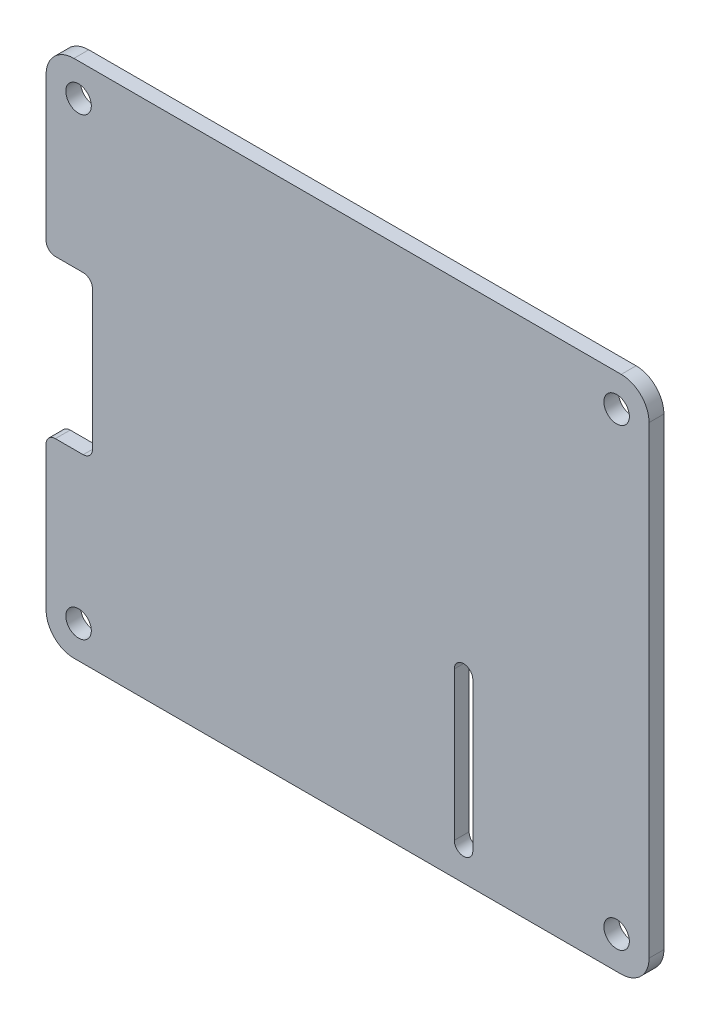
ISO-10303-21;
HEADER;
FILE_DESCRIPTION(('STEP AP214'),'2;1');
FILE_NAME('part.step','',(''),(''),'','','');
FILE_SCHEMA(('AUTOMOTIVE_DESIGN { 1 0 10303 214 1 1 1 1 }'));
ENDSEC;
DATA;
#1=APPLICATION_CONTEXT('core data for automotive mechanical design processes');
#2=APPLICATION_PROTOCOL_DEFINITION('international standard','automotive_design',2000,#1);
#3=PRODUCT_CONTEXT('',#1,'mechanical');
#4=PRODUCT('Part','Part','',(#3));
#5=PRODUCT_RELATED_PRODUCT_CATEGORY('part','',(#4));
#6=PRODUCT_DEFINITION_FORMATION('','',#4);
#7=PRODUCT_DEFINITION_CONTEXT('part definition',#1,'design');
#8=PRODUCT_DEFINITION('design','',#6,#7);
#9=PRODUCT_DEFINITION_SHAPE('','',#8);
#10=(LENGTH_UNIT() NAMED_UNIT(*) SI_UNIT(.MILLI.,.METRE.));
#11=(NAMED_UNIT(*) PLANE_ANGLE_UNIT() SI_UNIT($,.RADIAN.));
#12=(NAMED_UNIT(*) SI_UNIT($,.STERADIAN.) SOLID_ANGLE_UNIT());
#13=UNCERTAINTY_MEASURE_WITH_UNIT(LENGTH_MEASURE(1.E-05),#10,'distance_accuracy_value','');
#14=(GEOMETRIC_REPRESENTATION_CONTEXT(3) GLOBAL_UNCERTAINTY_ASSIGNED_CONTEXT((#13)) GLOBAL_UNIT_ASSIGNED_CONTEXT((#10,
#11,#12)) REPRESENTATION_CONTEXT('',''));
#15=CARTESIAN_POINT('',(0.,0.,0.));
#16=DIRECTION('',(0.,0.,1.));
#17=DIRECTION('',(1.,0.,0.));
#18=AXIS2_PLACEMENT_3D('',#15,#16,#17);
#19=CARTESIAN_POINT('',(-29.5,25.,1.6));
#20=DIRECTION('',(0.,0.,-1.));
#21=DIRECTION('',(-1.,0.,0.));
#22=AXIS2_PLACEMENT_3D('',#19,#20,#21);
#23=CYLINDRICAL_SURFACE('',#22,3.);
#24=CARTESIAN_POINT('',(-29.5,25.,0.));
#25=DIRECTION('',(0.,0.,1.));
#26=DIRECTION('',(1.,0.,0.));
#27=AXIS2_PLACEMENT_3D('',#24,#25,#26);
#28=CIRCLE('',#27,3.);
#29=CARTESIAN_POINT('',(-29.5,28.,0.));
#30=VERTEX_POINT('',#29);
#31=CARTESIAN_POINT('',(-32.5,25.,0.));
#32=VERTEX_POINT('',#31);
#33=EDGE_CURVE('E204',#30,#32,#28,.T.);
#34=ORIENTED_EDGE('',*,*,#33,.T.);
#35=DIRECTION('',(0.,0.,-1.));
#36=VECTOR('',#35,1.);
#37=CARTESIAN_POINT('',(-32.5,25.,1.6));
#38=LINE('',#37,#36);
#39=CARTESIAN_POINT('',(-32.5,25.,1.6));
#40=VERTEX_POINT('',#39);
#41=EDGE_CURVE('E11',#40,#32,#38,.T.);
#42=ORIENTED_EDGE('',*,*,#41,.F.);
#43=CARTESIAN_POINT('',(-29.5,25.,1.6));
#44=DIRECTION('',(0.,0.,1.));
#45=DIRECTION('',(1.,0.,0.));
#46=AXIS2_PLACEMENT_3D('',#43,#44,#45);
#47=CIRCLE('',#46,3.);
#48=CARTESIAN_POINT('',(-29.5,28.,1.6));
#49=VERTEX_POINT('',#48);
#50=EDGE_CURVE('E208',#49,#40,#47,.T.);
#51=ORIENTED_EDGE('',*,*,#50,.F.);
#52=DIRECTION('',(0.,0.,-1.));
#53=VECTOR('',#52,1.);
#54=CARTESIAN_POINT('',(-29.5,28.,1.6));
#55=LINE('',#54,#53);
#56=EDGE_CURVE('E248',#49,#30,#55,.T.);
#57=ORIENTED_EDGE('',*,*,#56,.T.);
#58=EDGE_LOOP('',(#34,#42,#51,#57));
#59=FACE_BOUND('',#58,.T.);
#60=ADVANCED_FACE('F32',(#59),#23,.T.);
#61=CARTESIAN_POINT('',(-32.5,9.50000000000001,1.6));
#62=DIRECTION('',(-1.,0.,0.));
#63=DIRECTION('',(0.,0.,1.));
#64=AXIS2_PLACEMENT_3D('',#61,#62,#63);
#65=PLANE('',#64);
#66=DIRECTION('',(0.,1.,0.));
#67=VECTOR('',#66,1.);
#68=CARTESIAN_POINT('',(-32.5,9.50000000000001,0.));
#69=LINE('',#68,#67);
#70=CARTESIAN_POINT('',(-32.5,9.50000000000001,0.));
#71=VERTEX_POINT('',#70);
#72=EDGE_CURVE('E251',#71,#32,#69,.T.);
#73=ORIENTED_EDGE('',*,*,#72,.F.);
#74=DIRECTION('',(0.,0.,-1.));
#75=VECTOR('',#74,1.);
#76=CARTESIAN_POINT('',(-32.5,9.50000000000001,1.6));
#77=LINE('',#76,#75);
#78=CARTESIAN_POINT('',(-32.5,9.50000000000001,1.6));
#79=VERTEX_POINT('',#78);
#80=EDGE_CURVE('E39',#79,#71,#77,.T.);
#81=ORIENTED_EDGE('',*,*,#80,.F.);
#82=DIRECTION('',(0.,1.,0.));
#83=VECTOR('',#82,1.);
#84=CARTESIAN_POINT('',(-32.5,9.50000000000001,1.6));
#85=LINE('',#84,#83);
#86=EDGE_CURVE('E210',#79,#40,#85,.T.);
#87=ORIENTED_EDGE('',*,*,#86,.T.);
#88=ORIENTED_EDGE('',*,*,#41,.T.);
#89=EDGE_LOOP('',(#73,#81,#87,#88));
#90=FACE_BOUND('',#89,.T.);
#91=ADVANCED_FACE('F331',(#90),#65,.T.);
#92=CARTESIAN_POINT('',(-31.5,9.5,1.6));
#93=DIRECTION('',(0.,0.,-1.));
#94=DIRECTION('',(-1.,0.,0.));
#95=AXIS2_PLACEMENT_3D('',#92,#93,#94);
#96=CYLINDRICAL_SURFACE('',#95,1.);
#97=CARTESIAN_POINT('',(-31.5,9.5,0.));
#98=DIRECTION('',(0.,0.,1.));
#99=DIRECTION('',(1.,0.,0.));
#100=AXIS2_PLACEMENT_3D('',#97,#98,#99);
#101=CIRCLE('',#100,1.);
#102=CARTESIAN_POINT('',(-31.5,8.5,0.));
#103=VERTEX_POINT('',#102);
#104=EDGE_CURVE('E254',#71,#103,#101,.T.);
#105=ORIENTED_EDGE('',*,*,#104,.T.);
#106=DIRECTION('',(0.,0.,-1.));
#107=VECTOR('',#106,1.);
#108=CARTESIAN_POINT('',(-31.5,8.5,1.6));
#109=LINE('',#108,#107);
#110=CARTESIAN_POINT('',(-31.5,8.5,1.6));
#111=VERTEX_POINT('',#110);
#112=EDGE_CURVE('E319',#111,#103,#109,.T.);
#113=ORIENTED_EDGE('',*,*,#112,.F.);
#114=CARTESIAN_POINT('',(-31.5,9.5,1.6));
#115=DIRECTION('',(0.,0.,1.));
#116=DIRECTION('',(1.,0.,0.));
#117=AXIS2_PLACEMENT_3D('',#114,#115,#116);
#118=CIRCLE('',#117,1.);
#119=EDGE_CURVE('E214',#79,#111,#118,.T.);
#120=ORIENTED_EDGE('',*,*,#119,.F.);
#121=ORIENTED_EDGE('',*,*,#80,.T.);
#122=EDGE_LOOP('',(#105,#113,#120,#121));
#123=FACE_BOUND('',#122,.T.);
#124=ADVANCED_FACE('F324',(#123),#96,.T.);
#125=CARTESIAN_POINT('',(-31.5,8.5,1.6));
#126=DIRECTION('',(0.,1.,0.));
#127=DIRECTION('',(-1.,0.,0.));
#128=AXIS2_PLACEMENT_3D('',#125,#126,#127);
#129=PLANE('',#128);
#130=DIRECTION('',(1.,0.,0.));
#131=VECTOR('',#130,1.);
#132=CARTESIAN_POINT('',(-31.5,8.5,0.));
#133=LINE('',#132,#131);
#134=CARTESIAN_POINT('',(-28.5,8.49999999999999,0.));
#135=VERTEX_POINT('',#134);
#136=EDGE_CURVE('E256',#103,#135,#133,.T.);
#137=ORIENTED_EDGE('',*,*,#136,.T.);
#138=DIRECTION('',(0.,0.,-1.));
#139=VECTOR('',#138,1.);
#140=CARTESIAN_POINT('',(-28.5,8.49999999999999,1.6));
#141=LINE('',#140,#139);
#142=CARTESIAN_POINT('',(-28.5,8.49999999999999,1.6));
#143=VERTEX_POINT('',#142);
#144=EDGE_CURVE('E317',#143,#135,#141,.T.);
#145=ORIENTED_EDGE('',*,*,#144,.F.);
#146=DIRECTION('',(1.,0.,0.));
#147=VECTOR('',#146,1.);
#148=CARTESIAN_POINT('',(-31.5,8.5,1.6));
#149=LINE('',#148,#147);
#150=EDGE_CURVE('E216',#111,#143,#149,.T.);
#151=ORIENTED_EDGE('',*,*,#150,.F.);
#152=ORIENTED_EDGE('',*,*,#112,.T.);
#153=EDGE_LOOP('',(#137,#145,#151,#152));
#154=FACE_BOUND('',#153,.T.);
#155=ADVANCED_FACE('F391',(#154),#129,.F.);
#156=CARTESIAN_POINT('',(-28.5,7.49999999999999,1.6));
#157=DIRECTION('',(0.,0.,-1.));
#158=DIRECTION('',(-1.,0.,0.));
#159=AXIS2_PLACEMENT_3D('',#156,#157,#158);
#160=CYLINDRICAL_SURFACE('',#159,1.);
#161=CARTESIAN_POINT('',(-28.5,7.49999999999999,0.));
#162=DIRECTION('',(0.,0.,1.));
#163=DIRECTION('',(1.,0.,0.));
#164=AXIS2_PLACEMENT_3D('',#161,#162,#163);
#165=CIRCLE('',#164,1.);
#166=CARTESIAN_POINT('',(-27.5,7.49999999999999,0.));
#167=VERTEX_POINT('',#166);
#168=EDGE_CURVE('E259',#167,#135,#165,.T.);
#169=ORIENTED_EDGE('',*,*,#168,.F.);
#170=DIRECTION('',(0.,0.,-1.));
#171=VECTOR('',#170,1.);
#172=CARTESIAN_POINT('',(-27.5,7.49999999999999,1.6));
#173=LINE('',#172,#171);
#174=CARTESIAN_POINT('',(-27.5,7.49999999999999,1.6));
#175=VERTEX_POINT('',#174);
#176=EDGE_CURVE('E315',#175,#167,#173,.T.);
#177=ORIENTED_EDGE('',*,*,#176,.F.);
#178=CARTESIAN_POINT('',(-28.5,7.49999999999999,1.6));
#179=DIRECTION('',(0.,0.,1.));
#180=DIRECTION('',(1.,0.,0.));
#181=AXIS2_PLACEMENT_3D('',#178,#179,#180);
#182=CIRCLE('',#181,1.);
#183=EDGE_CURVE('E218',#175,#143,#182,.T.);
#184=ORIENTED_EDGE('',*,*,#183,.T.);
#185=ORIENTED_EDGE('',*,*,#144,.T.);
#186=EDGE_LOOP('',(#169,#177,#184,#185));
#187=FACE_BOUND('',#186,.T.);
#188=ADVANCED_FACE('F386',(#187),#160,.F.);
#189=CARTESIAN_POINT('',(-27.5,-7.49999999999999,1.6));
#190=DIRECTION('',(-1.,0.,0.));
#191=DIRECTION('',(0.,0.,1.));
#192=AXIS2_PLACEMENT_3D('',#189,#190,#191);
#193=PLANE('',#192);
#194=DIRECTION('',(0.,1.,0.));
#195=VECTOR('',#194,1.);
#196=CARTESIAN_POINT('',(-27.5,-7.49999999999999,0.));
#197=LINE('',#196,#195);
#198=CARTESIAN_POINT('',(-27.5,-7.49999999999999,0.));
#199=VERTEX_POINT('',#198);
#200=EDGE_CURVE('E262',#199,#167,#197,.T.);
#201=ORIENTED_EDGE('',*,*,#200,.F.);
#202=DIRECTION('',(0.,0.,-1.));
#203=VECTOR('',#202,1.);
#204=CARTESIAN_POINT('',(-27.5,-7.49999999999999,1.6));
#205=LINE('',#204,#203);
#206=CARTESIAN_POINT('',(-27.5,-7.49999999999999,1.6));
#207=VERTEX_POINT('',#206);
#208=EDGE_CURVE('E313',#207,#199,#205,.T.);
#209=ORIENTED_EDGE('',*,*,#208,.F.);
#210=DIRECTION('',(0.,1.,0.));
#211=VECTOR('',#210,1.);
#212=CARTESIAN_POINT('',(-27.5,-7.49999999999999,1.6));
#213=LINE('',#212,#211);
#214=EDGE_CURVE('E221',#207,#175,#213,.T.);
#215=ORIENTED_EDGE('',*,*,#214,.T.);
#216=ORIENTED_EDGE('',*,*,#176,.T.);
#217=EDGE_LOOP('',(#201,#209,#215,#216));
#218=FACE_BOUND('',#217,.T.);
#219=ADVANCED_FACE('F383',(#218),#193,.T.);
#220=CARTESIAN_POINT('',(-28.5,-7.5,1.6));
#221=DIRECTION('',(0.,0.,-1.));
#222=DIRECTION('',(-1.,0.,0.));
#223=AXIS2_PLACEMENT_3D('',#220,#221,#222);
#224=CYLINDRICAL_SURFACE('',#223,1.);
#225=CARTESIAN_POINT('',(-28.5,-7.5,0.));
#226=DIRECTION('',(0.,0.,-1.));
#227=DIRECTION('',(-1.,0.,0.));
#228=AXIS2_PLACEMENT_3D('',#225,#226,#227);
#229=CIRCLE('',#228,1.);
#230=CARTESIAN_POINT('',(-28.5,-8.5,0.));
#231=VERTEX_POINT('',#230);
#232=EDGE_CURVE('E265',#199,#231,#229,.T.);
#233=ORIENTED_EDGE('',*,*,#232,.T.);
#234=DIRECTION('',(0.,0.,-1.));
#235=VECTOR('',#234,1.);
#236=CARTESIAN_POINT('',(-28.5,-8.5,1.6));
#237=LINE('',#236,#235);
#238=CARTESIAN_POINT('',(-28.5,-8.5,1.6));
#239=VERTEX_POINT('',#238);
#240=EDGE_CURVE('E311',#239,#231,#237,.T.);
#241=ORIENTED_EDGE('',*,*,#240,.F.);
#242=CARTESIAN_POINT('',(-28.5,-7.5,1.6));
#243=DIRECTION('',(0.,0.,-1.));
#244=DIRECTION('',(-1.,0.,0.));
#245=AXIS2_PLACEMENT_3D('',#242,#243,#244);
#246=CIRCLE('',#245,1.);
#247=EDGE_CURVE('E224',#207,#239,#246,.T.);
#248=ORIENTED_EDGE('',*,*,#247,.F.);
#249=ORIENTED_EDGE('',*,*,#208,.T.);
#250=EDGE_LOOP('',(#233,#241,#248,#249));
#251=FACE_BOUND('',#250,.T.);
#252=ADVANCED_FACE('F380',(#251),#224,.F.);
#253=CARTESIAN_POINT('',(-31.5,-8.5,1.6));
#254=DIRECTION('',(0.,1.,0.));
#255=DIRECTION('',(0.,0.,1.));
#256=AXIS2_PLACEMENT_3D('',#253,#254,#255);
#257=PLANE('',#256);
#258=DIRECTION('',(1.,0.,0.));
#259=VECTOR('',#258,1.);
#260=CARTESIAN_POINT('',(-31.5,-8.5,0.));
#261=LINE('',#260,#259);
#262=CARTESIAN_POINT('',(-31.5,-8.5,0.));
#263=VERTEX_POINT('',#262);
#264=EDGE_CURVE('E268',#263,#231,#261,.T.);
#265=ORIENTED_EDGE('',*,*,#264,.F.);
#266=DIRECTION('',(0.,0.,-1.));
#267=VECTOR('',#266,1.);
#268=CARTESIAN_POINT('',(-31.5,-8.5,1.6));
#269=LINE('',#268,#267);
#270=CARTESIAN_POINT('',(-31.5,-8.5,1.6));
#271=VERTEX_POINT('',#270);
#272=EDGE_CURVE('E309',#271,#263,#269,.T.);
#273=ORIENTED_EDGE('',*,*,#272,.F.);
#274=DIRECTION('',(1.,0.,0.));
#275=VECTOR('',#274,1.);
#276=CARTESIAN_POINT('',(-31.5,-8.5,1.6));
#277=LINE('',#276,#275);
#278=EDGE_CURVE('E226',#271,#239,#277,.T.);
#279=ORIENTED_EDGE('',*,*,#278,.T.);
#280=ORIENTED_EDGE('',*,*,#240,.T.);
#281=EDGE_LOOP('',(#265,#273,#279,#280));
#282=FACE_BOUND('',#281,.T.);
#283=ADVANCED_FACE('F375',(#282),#257,.T.);
#284=CARTESIAN_POINT('',(-31.5,-9.5,1.6));
#285=DIRECTION('',(0.,0.,-1.));
#286=DIRECTION('',(-1.,0.,0.));
#287=AXIS2_PLACEMENT_3D('',#284,#285,#286);
#288=CYLINDRICAL_SURFACE('',#287,1.);
#289=CARTESIAN_POINT('',(-31.5,-9.5,0.));
#290=DIRECTION('',(0.,0.,-1.));
#291=DIRECTION('',(-1.,0.,0.));
#292=AXIS2_PLACEMENT_3D('',#289,#290,#291);
#293=CIRCLE('',#292,1.);
#294=CARTESIAN_POINT('',(-32.5,-9.50000000000001,0.));
#295=VERTEX_POINT('',#294);
#296=EDGE_CURVE('E271',#295,#263,#293,.T.);
#297=ORIENTED_EDGE('',*,*,#296,.F.);
#298=DIRECTION('',(0.,0.,-1.));
#299=VECTOR('',#298,1.);
#300=CARTESIAN_POINT('',(-32.5,-9.50000000000001,1.6));
#301=LINE('',#300,#299);
#302=CARTESIAN_POINT('',(-32.5,-9.50000000000001,1.6));
#303=VERTEX_POINT('',#302);
#304=EDGE_CURVE('E307',#303,#295,#301,.T.);
#305=ORIENTED_EDGE('',*,*,#304,.F.);
#306=CARTESIAN_POINT('',(-31.5,-9.5,1.6));
#307=DIRECTION('',(0.,0.,-1.));
#308=DIRECTION('',(-1.,0.,0.));
#309=AXIS2_PLACEMENT_3D('',#306,#307,#308);
#310=CIRCLE('',#309,1.);
#311=EDGE_CURVE('E229',#303,#271,#310,.T.);
#312=ORIENTED_EDGE('',*,*,#311,.T.);
#313=ORIENTED_EDGE('',*,*,#272,.T.);
#314=EDGE_LOOP('',(#297,#305,#312,#313));
#315=FACE_BOUND('',#314,.T.);
#316=ADVANCED_FACE('F370',(#315),#288,.T.);
#317=CARTESIAN_POINT('',(-32.5,-25.,1.6));
#318=DIRECTION('',(-1.,0.,0.));
#319=DIRECTION('',(0.,0.,1.));
#320=AXIS2_PLACEMENT_3D('',#317,#318,#319);
#321=PLANE('',#320);
#322=DIRECTION('',(0.,1.,0.));
#323=VECTOR('',#322,1.);
#324=CARTESIAN_POINT('',(-32.5,-25.,0.));
#325=LINE('',#324,#323);
#326=CARTESIAN_POINT('',(-32.5,-25.,0.));
#327=VERTEX_POINT('',#326);
#328=EDGE_CURVE('E274',#327,#295,#325,.T.);
#329=ORIENTED_EDGE('',*,*,#328,.F.);
#330=DIRECTION('',(0.,0.,-1.));
#331=VECTOR('',#330,1.);
#332=CARTESIAN_POINT('',(-32.5,-25.,1.6));
#333=LINE('',#332,#331);
#334=CARTESIAN_POINT('',(-32.5,-25.,1.6));
#335=VERTEX_POINT('',#334);
#336=EDGE_CURVE('E305',#335,#327,#333,.T.);
#337=ORIENTED_EDGE('',*,*,#336,.F.);
#338=DIRECTION('',(0.,1.,0.));
#339=VECTOR('',#338,1.);
#340=CARTESIAN_POINT('',(-32.5,-25.,1.6));
#341=LINE('',#340,#339);
#342=EDGE_CURVE('E232',#335,#303,#341,.T.);
#343=ORIENTED_EDGE('',*,*,#342,.T.);
#344=ORIENTED_EDGE('',*,*,#304,.T.);
#345=EDGE_LOOP('',(#329,#337,#343,#344));
#346=FACE_BOUND('',#345,.T.);
#347=ADVANCED_FACE('F364',(#346),#321,.T.);
#348=CARTESIAN_POINT('',(-29.5,-25.,1.6));
#349=DIRECTION('',(0.,0.,-1.));
#350=DIRECTION('',(-1.,0.,0.));
#351=AXIS2_PLACEMENT_3D('',#348,#349,#350);
#352=CYLINDRICAL_SURFACE('',#351,3.);
#353=CARTESIAN_POINT('',(-29.5,-25.,0.));
#354=DIRECTION('',(0.,0.,1.));
#355=DIRECTION('',(1.,0.,0.));
#356=AXIS2_PLACEMENT_3D('',#353,#354,#355);
#357=CIRCLE('',#356,3.);
#358=CARTESIAN_POINT('',(-29.5,-28.,0.));
#359=VERTEX_POINT('',#358);
#360=EDGE_CURVE('E277',#327,#359,#357,.T.);
#361=ORIENTED_EDGE('',*,*,#360,.T.);
#362=DIRECTION('',(0.,0.,-1.));
#363=VECTOR('',#362,1.);
#364=CARTESIAN_POINT('',(-29.5,-28.,1.6));
#365=LINE('',#364,#363);
#366=CARTESIAN_POINT('',(-29.5,-28.,1.6));
#367=VERTEX_POINT('',#366);
#368=EDGE_CURVE('E302',#367,#359,#365,.T.);
#369=ORIENTED_EDGE('',*,*,#368,.F.);
#370=CARTESIAN_POINT('',(-29.5,-25.,1.6));
#371=DIRECTION('',(0.,0.,1.));
#372=DIRECTION('',(1.,0.,0.));
#373=AXIS2_PLACEMENT_3D('',#370,#371,#372);
#374=CIRCLE('',#373,3.);
#375=EDGE_CURVE('E235',#335,#367,#374,.T.);
#376=ORIENTED_EDGE('',*,*,#375,.F.);
#377=ORIENTED_EDGE('',*,*,#336,.T.);
#378=EDGE_LOOP('',(#361,#369,#376,#377));
#379=FACE_BOUND('',#378,.T.);
#380=ADVANCED_FACE('F394',(#379),#352,.T.);
#381=CARTESIAN_POINT('',(-29.5,-28.,1.6));
#382=DIRECTION('',(0.,1.,0.));
#383=DIRECTION('',(0.,0.,1.));
#384=AXIS2_PLACEMENT_3D('',#381,#382,#383);
#385=PLANE('',#384);
#386=DIRECTION('',(1.,0.,0.));
#387=VECTOR('',#386,1.);
#388=CARTESIAN_POINT('',(-29.5,-28.,0.));
#389=LINE('',#388,#387);
#390=CARTESIAN_POINT('',(29.5,-28.,0.));
#391=VERTEX_POINT('',#390);
#392=EDGE_CURVE('E279',#359,#391,#389,.T.);
#393=ORIENTED_EDGE('',*,*,#392,.T.);
#394=DIRECTION('',(0.,0.,-1.));
#395=VECTOR('',#394,1.);
#396=CARTESIAN_POINT('',(29.5,-28.,1.6));
#397=LINE('',#396,#395);
#398=CARTESIAN_POINT('',(29.5,-28.,1.6));
#399=VERTEX_POINT('',#398);
#400=EDGE_CURVE('E299',#399,#391,#397,.T.);
#401=ORIENTED_EDGE('',*,*,#400,.F.);
#402=DIRECTION('',(1.,0.,0.));
#403=VECTOR('',#402,1.);
#404=CARTESIAN_POINT('',(-29.5,-28.,1.6));
#405=LINE('',#404,#403);
#406=EDGE_CURVE('E237',#367,#399,#405,.T.);
#407=ORIENTED_EDGE('',*,*,#406,.F.);
#408=ORIENTED_EDGE('',*,*,#368,.T.);
#409=EDGE_LOOP('',(#393,#401,#407,#408));
#410=FACE_BOUND('',#409,.T.);
#411=ADVANCED_FACE('F358',(#410),#385,.F.);
#412=CARTESIAN_POINT('',(29.5,-25.,1.6));
#413=DIRECTION('',(0.,0.,-1.));
#414=DIRECTION('',(-1.,0.,0.));
#415=AXIS2_PLACEMENT_3D('',#412,#413,#414);
#416=CYLINDRICAL_SURFACE('',#415,3.);
#417=CARTESIAN_POINT('',(29.5,-25.,0.));
#418=DIRECTION('',(0.,0.,1.));
#419=DIRECTION('',(1.,0.,0.));
#420=AXIS2_PLACEMENT_3D('',#417,#418,#419);
#421=CIRCLE('',#420,3.);
#422=CARTESIAN_POINT('',(32.5,-25.,0.));
#423=VERTEX_POINT('',#422);
#424=EDGE_CURVE('E281',#391,#423,#421,.T.);
#425=ORIENTED_EDGE('',*,*,#424,.T.);
#426=DIRECTION('',(0.,0.,-1.));
#427=VECTOR('',#426,1.);
#428=CARTESIAN_POINT('',(32.5,-25.,1.6));
#429=LINE('',#428,#427);
#430=CARTESIAN_POINT('',(32.5,-25.,1.6));
#431=VERTEX_POINT('',#430);
#432=EDGE_CURVE('E296',#431,#423,#429,.T.);
#433=ORIENTED_EDGE('',*,*,#432,.F.);
#434=CARTESIAN_POINT('',(29.5,-25.,1.6));
#435=DIRECTION('',(0.,0.,1.));
#436=DIRECTION('',(1.,0.,0.));
#437=AXIS2_PLACEMENT_3D('',#434,#435,#436);
#438=CIRCLE('',#437,3.);
#439=EDGE_CURVE('E239',#399,#431,#438,.T.);
#440=ORIENTED_EDGE('',*,*,#439,.F.);
#441=ORIENTED_EDGE('',*,*,#400,.T.);
#442=EDGE_LOOP('',(#425,#433,#440,#441));
#443=FACE_BOUND('',#442,.T.);
#444=ADVANCED_FACE('F354',(#443),#416,.T.);
#445=CARTESIAN_POINT('',(32.5,-25.,1.6));
#446=DIRECTION('',(-1.,0.,0.));
#447=DIRECTION('',(0.,0.,1.));
#448=AXIS2_PLACEMENT_3D('',#445,#446,#447);
#449=PLANE('',#448);
#450=DIRECTION('',(0.,1.,0.));
#451=VECTOR('',#450,1.);
#452=CARTESIAN_POINT('',(32.5,-25.,0.));
#453=LINE('',#452,#451);
#454=CARTESIAN_POINT('',(32.5,25.,0.));
#455=VERTEX_POINT('',#454);
#456=EDGE_CURVE('E283',#423,#455,#453,.T.);
#457=ORIENTED_EDGE('',*,*,#456,.T.);
#458=DIRECTION('',(0.,0.,-1.));
#459=VECTOR('',#458,1.);
#460=CARTESIAN_POINT('',(32.5,25.,1.6));
#461=LINE('',#460,#459);
#462=CARTESIAN_POINT('',(32.5,25.,1.6));
#463=VERTEX_POINT('',#462);
#464=EDGE_CURVE('E293',#463,#455,#461,.T.);
#465=ORIENTED_EDGE('',*,*,#464,.F.);
#466=DIRECTION('',(0.,1.,0.));
#467=VECTOR('',#466,1.);
#468=CARTESIAN_POINT('',(32.5,-25.,1.6));
#469=LINE('',#468,#467);
#470=EDGE_CURVE('E241',#431,#463,#469,.T.);
#471=ORIENTED_EDGE('',*,*,#470,.F.);
#472=ORIENTED_EDGE('',*,*,#432,.T.);
#473=EDGE_LOOP('',(#457,#465,#471,#472));
#474=FACE_BOUND('',#473,.T.);
#475=ADVANCED_FACE('F349',(#474),#449,.F.);
#476=CARTESIAN_POINT('',(29.5,25.,1.6));
#477=DIRECTION('',(0.,0.,-1.));
#478=DIRECTION('',(-1.,0.,0.));
#479=AXIS2_PLACEMENT_3D('',#476,#477,#478);
#480=CYLINDRICAL_SURFACE('',#479,3.);
#481=CARTESIAN_POINT('',(29.5,25.,0.));
#482=DIRECTION('',(0.,0.,1.));
#483=DIRECTION('',(1.,0.,0.));
#484=AXIS2_PLACEMENT_3D('',#481,#482,#483);
#485=CIRCLE('',#484,3.);
#486=CARTESIAN_POINT('',(29.5,28.,0.));
#487=VERTEX_POINT('',#486);
#488=EDGE_CURVE('E285',#455,#487,#485,.T.);
#489=ORIENTED_EDGE('',*,*,#488,.T.);
#490=DIRECTION('',(0.,0.,-1.));
#491=VECTOR('',#490,1.);
#492=CARTESIAN_POINT('',(29.5,28.,1.6));
#493=LINE('',#492,#491);
#494=CARTESIAN_POINT('',(29.5,28.,1.6));
#495=VERTEX_POINT('',#494);
#496=EDGE_CURVE('E291',#495,#487,#493,.T.);
#497=ORIENTED_EDGE('',*,*,#496,.F.);
#498=CARTESIAN_POINT('',(29.5,25.,1.6));
#499=DIRECTION('',(0.,0.,1.));
#500=DIRECTION('',(1.,0.,0.));
#501=AXIS2_PLACEMENT_3D('',#498,#499,#500);
#502=CIRCLE('',#501,3.);
#503=EDGE_CURVE('E243',#463,#495,#502,.T.);
#504=ORIENTED_EDGE('',*,*,#503,.F.);
#505=ORIENTED_EDGE('',*,*,#464,.T.);
#506=EDGE_LOOP('',(#489,#497,#504,#505));
#507=FACE_BOUND('',#506,.T.);
#508=ADVANCED_FACE('F343',(#507),#480,.T.);
#509=CARTESIAN_POINT('',(-29.5,28.,1.6));
#510=DIRECTION('',(0.,1.,0.));
#511=DIRECTION('',(0.,0.,1.));
#512=AXIS2_PLACEMENT_3D('',#509,#510,#511);
#513=PLANE('',#512);
#514=DIRECTION('',(1.,0.,0.));
#515=VECTOR('',#514,1.);
#516=CARTESIAN_POINT('',(-29.5,28.,0.));
#517=LINE('',#516,#515);
#518=EDGE_CURVE('E211',#30,#487,#517,.T.);
#519=ORIENTED_EDGE('',*,*,#518,.F.);
#520=ORIENTED_EDGE('',*,*,#56,.F.);
#521=DIRECTION('',(1.,0.,0.));
#522=VECTOR('',#521,1.);
#523=CARTESIAN_POINT('',(-29.5,28.,1.6));
#524=LINE('',#523,#522);
#525=EDGE_CURVE('E245',#49,#495,#524,.T.);
#526=ORIENTED_EDGE('',*,*,#525,.T.);
#527=ORIENTED_EDGE('',*,*,#496,.T.);
#528=EDGE_LOOP('',(#519,#520,#526,#527));
#529=FACE_BOUND('',#528,.T.);
#530=ADVANCED_FACE('F338',(#529),#513,.T.);
#531=CARTESIAN_POINT('',(-29.5,25.,1.6));
#532=DIRECTION('',(0.,0.,1.));
#533=DIRECTION('',(1.,0.,0.));
#534=AXIS2_PLACEMENT_3D('',#531,#532,#533);
#535=PLANE('',#534);
#536=CARTESIAN_POINT('',(-29.,-24.5,1.6));
#537=DIRECTION('',(0.,0.,1.));
#538=DIRECTION('',(-1.,0.,0.));
#539=AXIS2_PLACEMENT_3D('',#536,#537,#538);
#540=CIRCLE('',#539,1.375);
#541=CARTESIAN_POINT('',(-30.375,-24.5,1.6));
#542=VERTEX_POINT('',#541);
#543=EDGE_CURVE('E576',#542,#542,#540,.T.);
#544=ORIENTED_EDGE('',*,*,#543,.F.);
#545=EDGE_LOOP('',(#544));
#546=FACE_BOUND('',#545,.T.);
#547=CARTESIAN_POINT('',(29.,-24.5,1.6));
#548=DIRECTION('',(0.,0.,1.));
#549=DIRECTION('',(-1.,0.,0.));
#550=AXIS2_PLACEMENT_3D('',#547,#548,#549);
#551=CIRCLE('',#550,1.375);
#552=CARTESIAN_POINT('',(27.625,-24.5,1.6));
#553=VERTEX_POINT('',#552);
#554=EDGE_CURVE('E578',#553,#553,#551,.T.);
#555=ORIENTED_EDGE('',*,*,#554,.F.);
#556=EDGE_LOOP('',(#555));
#557=FACE_BOUND('',#556,.T.);
#558=CARTESIAN_POINT('',(29.,24.5,1.6));
#559=DIRECTION('',(0.,0.,1.));
#560=DIRECTION('',(1.,0.,0.));
#561=AXIS2_PLACEMENT_3D('',#558,#559,#560);
#562=CIRCLE('',#561,1.375);
#563=CARTESIAN_POINT('',(30.375,24.5,1.6));
#564=VERTEX_POINT('',#563);
#565=EDGE_CURVE('E589',#564,#564,#562,.T.);
#566=ORIENTED_EDGE('',*,*,#565,.F.);
#567=EDGE_LOOP('',(#566));
#568=FACE_BOUND('',#567,.T.);
#569=CARTESIAN_POINT('',(-29.,24.5,1.6));
#570=DIRECTION('',(0.,0.,1.));
#571=DIRECTION('',(1.,0.,0.));
#572=AXIS2_PLACEMENT_3D('',#569,#570,#571);
#573=CIRCLE('',#572,1.375);
#574=CARTESIAN_POINT('',(-27.625,24.5,1.6));
#575=VERTEX_POINT('',#574);
#576=EDGE_CURVE('E191',#575,#575,#573,.T.);
#577=ORIENTED_EDGE('',*,*,#576,.F.);
#578=EDGE_LOOP('',(#577));
#579=FACE_BOUND('',#578,.T.);
#580=CARTESIAN_POINT('',(12.5,-8.49999999999999,1.6));
#581=DIRECTION('',(0.,0.,1.));
#582=DIRECTION('',(1.,0.,0.));
#583=AXIS2_PLACEMENT_3D('',#580,#581,#582);
#584=CIRCLE('',#583,1.);
#585=CARTESIAN_POINT('',(13.5,-8.49999999999999,1.6));
#586=VERTEX_POINT('',#585);
#587=CARTESIAN_POINT('',(11.5,-8.49999999999999,1.6));
#588=VERTEX_POINT('',#587);
#589=EDGE_CURVE('E46',#586,#588,#584,.T.);
#590=ORIENTED_EDGE('',*,*,#589,.F.);
#591=DIRECTION('',(0.,1.,0.));
#592=VECTOR('',#591,1.);
#593=CARTESIAN_POINT('',(13.5,-8.49999999999999,1.6));
#594=LINE('',#593,#592);
#595=CARTESIAN_POINT('',(13.5,-24.5,1.6));
#596=VERTEX_POINT('',#595);
#597=EDGE_CURVE('E185',#596,#586,#594,.T.);
#598=ORIENTED_EDGE('',*,*,#597,.F.);
#599=CARTESIAN_POINT('',(12.5,-24.5,1.6));
#600=DIRECTION('',(0.,0.,1.));
#601=DIRECTION('',(1.,0.,0.));
#602=AXIS2_PLACEMENT_3D('',#599,#600,#601);
#603=CIRCLE('',#602,0.999999999999999);
#604=CARTESIAN_POINT('',(11.5,-24.5,1.6));
#605=VERTEX_POINT('',#604);
#606=EDGE_CURVE('E188',#605,#596,#603,.T.);
#607=ORIENTED_EDGE('',*,*,#606,.F.);
#608=DIRECTION('',(0.,-1.,0.));
#609=VECTOR('',#608,1.);
#610=CARTESIAN_POINT('',(11.5,-8.49999999999999,1.6));
#611=LINE('',#610,#609);
#612=EDGE_CURVE('E197',#588,#605,#611,.T.);
#613=ORIENTED_EDGE('',*,*,#612,.F.);
#614=EDGE_LOOP('',(#590,#598,#607,#613));
#615=FACE_BOUND('',#614,.T.);
#616=ORIENTED_EDGE('',*,*,#50,.T.);
#617=ORIENTED_EDGE('',*,*,#86,.F.);
#618=ORIENTED_EDGE('',*,*,#119,.T.);
#619=ORIENTED_EDGE('',*,*,#150,.T.);
#620=ORIENTED_EDGE('',*,*,#183,.F.);
#621=ORIENTED_EDGE('',*,*,#214,.F.);
#622=ORIENTED_EDGE('',*,*,#247,.T.);
#623=ORIENTED_EDGE('',*,*,#278,.F.);
#624=ORIENTED_EDGE('',*,*,#311,.F.);
#625=ORIENTED_EDGE('',*,*,#342,.F.);
#626=ORIENTED_EDGE('',*,*,#375,.T.);
#627=ORIENTED_EDGE('',*,*,#406,.T.);
#628=ORIENTED_EDGE('',*,*,#439,.T.);
#629=ORIENTED_EDGE('',*,*,#470,.T.);
#630=ORIENTED_EDGE('',*,*,#503,.T.);
#631=ORIENTED_EDGE('',*,*,#525,.F.);
#632=EDGE_LOOP('',(#616,#617,#618,#619,#620,#621,#622,#623,#624,#625,#626,#627,#628,#629,#630,#631));
#633=FACE_BOUND('',#632,.T.);
#634=ADVANCED_FACE('F393',(#546,#557,#568,#579,#615,#633),#535,.T.);
#635=CARTESIAN_POINT('',(-29.5,25.,0.));
#636=DIRECTION('',(0.,0.,1.));
#637=DIRECTION('',(1.,0.,0.));
#638=AXIS2_PLACEMENT_3D('',#635,#636,#637);
#639=PLANE('',#638);
#640=CARTESIAN_POINT('',(-29.,-24.5,0.));
#641=DIRECTION('',(0.,0.,1.));
#642=DIRECTION('',(-1.,0.,0.));
#643=AXIS2_PLACEMENT_3D('',#640,#641,#642);
#644=CIRCLE('',#643,1.375);
#645=CARTESIAN_POINT('',(-30.375,-24.5,0.));
#646=VERTEX_POINT('',#645);
#647=EDGE_CURVE('E573',#646,#646,#644,.T.);
#648=ORIENTED_EDGE('',*,*,#647,.T.);
#649=EDGE_LOOP('',(#648));
#650=FACE_BOUND('',#649,.T.);
#651=CARTESIAN_POINT('',(29.,-24.5,0.));
#652=DIRECTION('',(0.,0.,1.));
#653=DIRECTION('',(-1.,0.,0.));
#654=AXIS2_PLACEMENT_3D('',#651,#652,#653);
#655=CIRCLE('',#654,1.375);
#656=CARTESIAN_POINT('',(27.625,-24.5,0.));
#657=VERTEX_POINT('',#656);
#658=EDGE_CURVE('E594',#657,#657,#655,.T.);
#659=ORIENTED_EDGE('',*,*,#658,.T.);
#660=EDGE_LOOP('',(#659));
#661=FACE_BOUND('',#660,.T.);
#662=CARTESIAN_POINT('',(29.,24.5,0.));
#663=DIRECTION('',(0.,0.,1.));
#664=DIRECTION('',(1.,0.,0.));
#665=AXIS2_PLACEMENT_3D('',#662,#663,#664);
#666=CIRCLE('',#665,1.375);
#667=CARTESIAN_POINT('',(30.375,24.5,0.));
#668=VERTEX_POINT('',#667);
#669=EDGE_CURVE('E585',#668,#668,#666,.T.);
#670=ORIENTED_EDGE('',*,*,#669,.T.);
#671=EDGE_LOOP('',(#670));
#672=FACE_BOUND('',#671,.T.);
#673=CARTESIAN_POINT('',(-29.,24.5,0.));
#674=DIRECTION('',(0.,0.,1.));
#675=DIRECTION('',(1.,0.,0.));
#676=AXIS2_PLACEMENT_3D('',#673,#674,#675);
#677=CIRCLE('',#676,1.375);
#678=CARTESIAN_POINT('',(-27.625,24.5,0.));
#679=VERTEX_POINT('',#678);
#680=EDGE_CURVE('E198',#679,#679,#677,.T.);
#681=ORIENTED_EDGE('',*,*,#680,.T.);
#682=EDGE_LOOP('',(#681));
#683=FACE_BOUND('',#682,.T.);
#684=DIRECTION('',(0.,1.,0.));
#685=VECTOR('',#684,1.);
#686=CARTESIAN_POINT('',(13.5,-8.49999999999999,0.));
#687=LINE('',#686,#685);
#688=CARTESIAN_POINT('',(13.5,-24.5,0.));
#689=VERTEX_POINT('',#688);
#690=CARTESIAN_POINT('',(13.5,-8.49999999999999,0.));
#691=VERTEX_POINT('',#690);
#692=EDGE_CURVE('E175',#689,#691,#687,.T.);
#693=ORIENTED_EDGE('',*,*,#692,.T.);
#694=CARTESIAN_POINT('',(12.5,-8.49999999999999,0.));
#695=DIRECTION('',(0.,0.,1.));
#696=DIRECTION('',(1.,0.,0.));
#697=AXIS2_PLACEMENT_3D('',#694,#695,#696);
#698=CIRCLE('',#697,1.);
#699=CARTESIAN_POINT('',(11.5,-8.49999999999999,0.));
#700=VERTEX_POINT('',#699);
#701=EDGE_CURVE('E169',#691,#700,#698,.T.);
#702=ORIENTED_EDGE('',*,*,#701,.T.);
#703=DIRECTION('',(0.,-1.,0.));
#704=VECTOR('',#703,1.);
#705=CARTESIAN_POINT('',(11.5,-8.49999999999999,0.));
#706=LINE('',#705,#704);
#707=CARTESIAN_POINT('',(11.5,-24.5,0.));
#708=VERTEX_POINT('',#707);
#709=EDGE_CURVE('E178',#700,#708,#706,.T.);
#710=ORIENTED_EDGE('',*,*,#709,.T.);
#711=CARTESIAN_POINT('',(12.5,-24.5,0.));
#712=DIRECTION('',(0.,0.,1.));
#713=DIRECTION('',(1.,0.,0.));
#714=AXIS2_PLACEMENT_3D('',#711,#712,#713);
#715=CIRCLE('',#714,0.999999999999999);
#716=EDGE_CURVE('E54',#708,#689,#715,.T.);
#717=ORIENTED_EDGE('',*,*,#716,.T.);
#718=EDGE_LOOP('',(#693,#702,#710,#717));
#719=FACE_BOUND('',#718,.T.);
#720=ORIENTED_EDGE('',*,*,#33,.F.);
#721=ORIENTED_EDGE('',*,*,#518,.T.);
#722=ORIENTED_EDGE('',*,*,#488,.F.);
#723=ORIENTED_EDGE('',*,*,#456,.F.);
#724=ORIENTED_EDGE('',*,*,#424,.F.);
#725=ORIENTED_EDGE('',*,*,#392,.F.);
#726=ORIENTED_EDGE('',*,*,#360,.F.);
#727=ORIENTED_EDGE('',*,*,#328,.T.);
#728=ORIENTED_EDGE('',*,*,#296,.T.);
#729=ORIENTED_EDGE('',*,*,#264,.T.);
#730=ORIENTED_EDGE('',*,*,#232,.F.);
#731=ORIENTED_EDGE('',*,*,#200,.T.);
#732=ORIENTED_EDGE('',*,*,#168,.T.);
#733=ORIENTED_EDGE('',*,*,#136,.F.);
#734=ORIENTED_EDGE('',*,*,#104,.F.);
#735=ORIENTED_EDGE('',*,*,#72,.T.);
#736=EDGE_LOOP('',(#720,#721,#722,#723,#724,#725,#726,#727,#728,#729,#730,#731,#732,#733,#734,#735));
#737=FACE_BOUND('',#736,.T.);
#738=ADVANCED_FACE('F182',(#650,#661,#672,#683,#719,#737),#639,.F.);
#739=CARTESIAN_POINT('',(12.5,-8.49999999999999,0.));
#740=DIRECTION('',(0.,0.,1.));
#741=DIRECTION('',(1.,0.,0.));
#742=AXIS2_PLACEMENT_3D('',#739,#740,#741);
#743=CYLINDRICAL_SURFACE('',#742,1.);
#744=ORIENTED_EDGE('',*,*,#589,.T.);
#745=DIRECTION('',(0.,0.,1.));
#746=VECTOR('',#745,1.);
#747=CARTESIAN_POINT('',(11.5,-8.49999999999999,0.));
#748=LINE('',#747,#746);
#749=EDGE_CURVE('E165',#700,#588,#748,.T.);
#750=ORIENTED_EDGE('',*,*,#749,.F.);
#751=ORIENTED_EDGE('',*,*,#701,.F.);
#752=DIRECTION('',(0.,0.,1.));
#753=VECTOR('',#752,1.);
#754=CARTESIAN_POINT('',(13.5,-8.49999999999999,0.));
#755=LINE('',#754,#753);
#756=EDGE_CURVE('E202',#691,#586,#755,.T.);
#757=ORIENTED_EDGE('',*,*,#756,.T.);
#758=EDGE_LOOP('',(#744,#750,#751,#757));
#759=FACE_BOUND('',#758,.T.);
#760=ADVANCED_FACE('F167',(#759),#743,.F.);
#761=CARTESIAN_POINT('',(13.5,-8.49999999999999,0.));
#762=DIRECTION('',(1.,0.,0.));
#763=DIRECTION('',(0.,1.,0.));
#764=AXIS2_PLACEMENT_3D('',#761,#762,#763);
#765=PLANE('',#764);
#766=ORIENTED_EDGE('',*,*,#597,.T.);
#767=ORIENTED_EDGE('',*,*,#756,.F.);
#768=ORIENTED_EDGE('',*,*,#692,.F.);
#769=DIRECTION('',(0.,0.,1.));
#770=VECTOR('',#769,1.);
#771=CARTESIAN_POINT('',(13.5,-24.5,0.));
#772=LINE('',#771,#770);
#773=EDGE_CURVE('E205',#689,#596,#772,.T.);
#774=ORIENTED_EDGE('',*,*,#773,.T.);
#775=EDGE_LOOP('',(#766,#767,#768,#774));
#776=FACE_BOUND('',#775,.T.);
#777=ADVANCED_FACE('F484',(#776),#765,.F.);
#778=CARTESIAN_POINT('',(12.5,-24.5,0.));
#779=DIRECTION('',(0.,0.,1.));
#780=DIRECTION('',(1.,0.,0.));
#781=AXIS2_PLACEMENT_3D('',#778,#779,#780);
#782=CYLINDRICAL_SURFACE('',#781,0.999999999999999);
#783=ORIENTED_EDGE('',*,*,#606,.T.);
#784=ORIENTED_EDGE('',*,*,#773,.F.);
#785=ORIENTED_EDGE('',*,*,#716,.F.);
#786=DIRECTION('',(0.,0.,1.));
#787=VECTOR('',#786,1.);
#788=CARTESIAN_POINT('',(11.5,-24.5,0.));
#789=LINE('',#788,#787);
#790=EDGE_CURVE('E174',#708,#605,#789,.T.);
#791=ORIENTED_EDGE('',*,*,#790,.T.);
#792=EDGE_LOOP('',(#783,#784,#785,#791));
#793=FACE_BOUND('',#792,.T.);
#794=ADVANCED_FACE('F495',(#793),#782,.F.);
#795=CARTESIAN_POINT('',(11.5,-8.49999999999999,0.));
#796=DIRECTION('',(-1.,0.,0.));
#797=DIRECTION('',(0.,-1.,0.));
#798=AXIS2_PLACEMENT_3D('',#795,#796,#797);
#799=PLANE('',#798);
#800=ORIENTED_EDGE('',*,*,#612,.T.);
#801=ORIENTED_EDGE('',*,*,#790,.F.);
#802=ORIENTED_EDGE('',*,*,#709,.F.);
#803=ORIENTED_EDGE('',*,*,#749,.T.);
#804=EDGE_LOOP('',(#800,#801,#802,#803));
#805=FACE_BOUND('',#804,.T.);
#806=ADVANCED_FACE('F179',(#805),#799,.F.);
#807=CARTESIAN_POINT('',(-29.,24.5,0.));
#808=DIRECTION('',(0.,0.,1.));
#809=DIRECTION('',(1.,0.,0.));
#810=AXIS2_PLACEMENT_3D('',#807,#808,#809);
#811=CYLINDRICAL_SURFACE('',#810,1.375);
#812=ORIENTED_EDGE('',*,*,#680,.F.);
#813=EDGE_LOOP('',(#812));
#814=FACE_BOUND('',#813,.T.);
#815=ORIENTED_EDGE('',*,*,#576,.T.);
#816=EDGE_LOOP('',(#815));
#817=FACE_BOUND('',#816,.T.);
#818=ADVANCED_FACE('F513',(#814,#817),#811,.F.);
#819=CARTESIAN_POINT('',(29.,24.5,0.));
#820=DIRECTION('',(0.,0.,1.));
#821=DIRECTION('',(1.,0.,0.));
#822=AXIS2_PLACEMENT_3D('',#819,#820,#821);
#823=CYLINDRICAL_SURFACE('',#822,1.375);
#824=ORIENTED_EDGE('',*,*,#669,.F.);
#825=EDGE_LOOP('',(#824));
#826=FACE_BOUND('',#825,.T.);
#827=ORIENTED_EDGE('',*,*,#565,.T.);
#828=EDGE_LOOP('',(#827));
#829=FACE_BOUND('',#828,.T.);
#830=ADVANCED_FACE('F536',(#826,#829),#823,.F.);
#831=CARTESIAN_POINT('',(29.,-24.5,0.));
#832=DIRECTION('',(0.,0.,1.));
#833=DIRECTION('',(1.,0.,0.));
#834=AXIS2_PLACEMENT_3D('',#831,#832,#833);
#835=CYLINDRICAL_SURFACE('',#834,1.375);
#836=ORIENTED_EDGE('',*,*,#658,.F.);
#837=EDGE_LOOP('',(#836));
#838=FACE_BOUND('',#837,.T.);
#839=ORIENTED_EDGE('',*,*,#554,.T.);
#840=EDGE_LOOP('',(#839));
#841=FACE_BOUND('',#840,.T.);
#842=ADVANCED_FACE('F546',(#838,#841),#835,.F.);
#843=CARTESIAN_POINT('',(-29.,-24.5,0.));
#844=DIRECTION('',(0.,0.,1.));
#845=DIRECTION('',(1.,0.,0.));
#846=AXIS2_PLACEMENT_3D('',#843,#844,#845);
#847=CYLINDRICAL_SURFACE('',#846,1.375);
#848=ORIENTED_EDGE('',*,*,#647,.F.);
#849=EDGE_LOOP('',(#848));
#850=FACE_BOUND('',#849,.T.);
#851=ORIENTED_EDGE('',*,*,#543,.T.);
#852=EDGE_LOOP('',(#851));
#853=FACE_BOUND('',#852,.T.);
#854=ADVANCED_FACE('F556',(#850,#853),#847,.F.);
#855=CLOSED_SHELL('',(#60,#91,#124,#155,#188,#219,#252,#283,#316,#347,#380,#411,#444,#475,#508,
#530,#634,#738,#760,#777,#794,#806,#818,#830,#842,#854));
#856=MANIFOLD_SOLID_BREP('B2',#855);
#857=ADVANCED_BREP_SHAPE_REPRESENTATION('',(#18,#856),#14);
#858=SHAPE_DEFINITION_REPRESENTATION(#9,#857);
ENDSEC;
END-ISO-10303-21;
